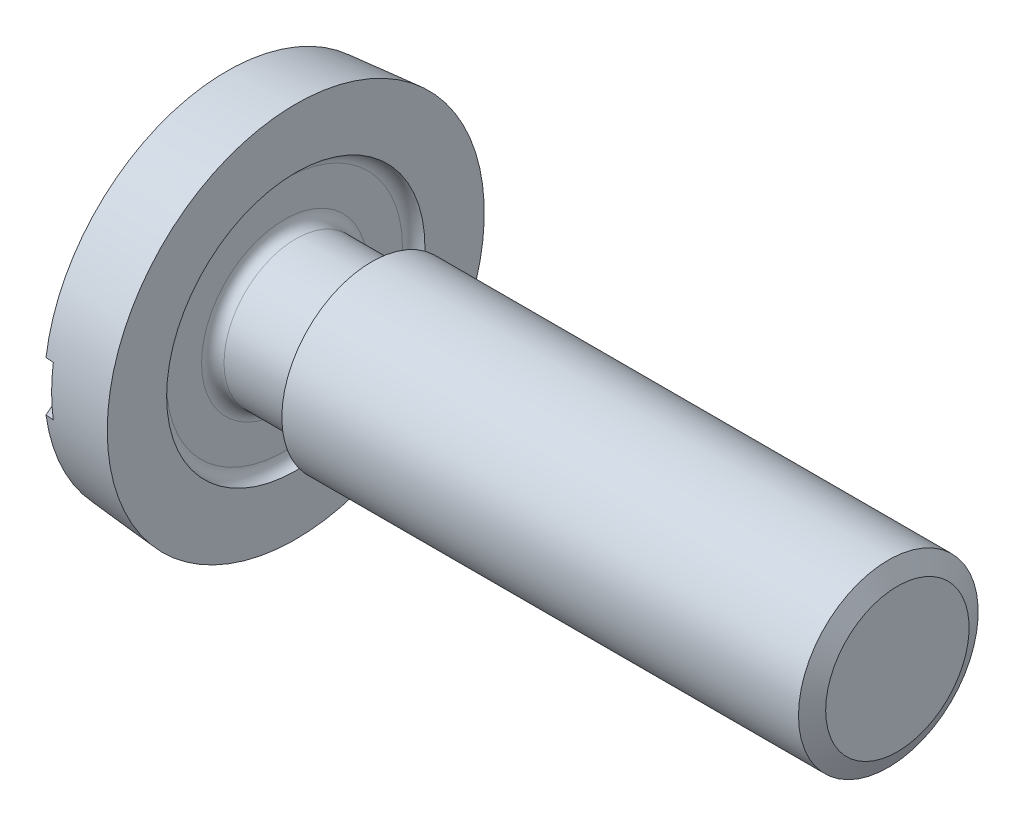
ISO-10303-21;
HEADER;
FILE_DESCRIPTION(('STEP AP214'),'2;1');
FILE_NAME('part.step','',(''),(''),'','','');
FILE_SCHEMA(('AUTOMOTIVE_DESIGN { 1 0 10303 214 1 1 1 1 }'));
ENDSEC;
DATA;
#1=APPLICATION_CONTEXT('core data for automotive mechanical design processes');
#2=APPLICATION_PROTOCOL_DEFINITION('international standard','automotive_design',2000,#1);
#3=PRODUCT_CONTEXT('',#1,'mechanical');
#4=PRODUCT('Part','Part','',(#3));
#5=PRODUCT_RELATED_PRODUCT_CATEGORY('part','',(#4));
#6=PRODUCT_DEFINITION_FORMATION('','',#4);
#7=PRODUCT_DEFINITION_CONTEXT('part definition',#1,'design');
#8=PRODUCT_DEFINITION('design','',#6,#7);
#9=PRODUCT_DEFINITION_SHAPE('','',#8);
#10=(LENGTH_UNIT() NAMED_UNIT(*) SI_UNIT(.MILLI.,.METRE.));
#11=(NAMED_UNIT(*) PLANE_ANGLE_UNIT() SI_UNIT($,.RADIAN.));
#12=(NAMED_UNIT(*) SI_UNIT($,.STERADIAN.) SOLID_ANGLE_UNIT());
#13=UNCERTAINTY_MEASURE_WITH_UNIT(LENGTH_MEASURE(1.E-05),#10,'distance_accuracy_value','');
#14=(GEOMETRIC_REPRESENTATION_CONTEXT(3) GLOBAL_UNCERTAINTY_ASSIGNED_CONTEXT((#13)) GLOBAL_UNIT_ASSIGNED_CONTEXT((#10,
#11,#12)) REPRESENTATION_CONTEXT('',''));
#15=CARTESIAN_POINT('',(0.,0.,0.));
#16=DIRECTION('',(0.,0.,1.));
#17=DIRECTION('',(1.,0.,0.));
#18=AXIS2_PLACEMENT_3D('',#15,#16,#17);
#19=CARTESIAN_POINT('',(5.16195553502615,0.,0.));
#20=DIRECTION('',(-1.,0.,0.));
#21=DIRECTION('',(0.,1.,0.));
#22=AXIS2_PLACEMENT_3D('',#19,#20,#21);
#23=SPHERICAL_SURFACE('',#22,6.88915553502615);
#24=CARTESIAN_POINT('',(-1.0922,0.,0.));
#25=DIRECTION('',(-1.,0.,0.));
#26=DIRECTION('',(0.,0.,1.));
#27=AXIS2_PLACEMENT_3D('',#24,#25,#26);
#28=CIRCLE('',#27,2.88894488169699);
#29=CARTESIAN_POINT('',(-1.0922,-0.3937,-2.861992809125));
#30=VERTEX_POINT('',#29);
#31=CARTESIAN_POINT('',(-1.0922,-0.3937,2.861992809125));
#32=VERTEX_POINT('',#31);
#33=EDGE_CURVE('E131',#30,#32,#28,.T.);
#34=ORIENTED_EDGE('',*,*,#33,.T.);
#35=CARTESIAN_POINT('',(5.16195553502615,-0.3937,0.));
#36=DIRECTION('',(0.,-1.,0.));
#37=DIRECTION('',(0.,0.,-1.));
#38=AXIS2_PLACEMENT_3D('',#35,#36,#37);
#39=CIRCLE('',#38,6.8778967930452);
#40=EDGE_CURVE('E79',#32,#30,#39,.T.);
#41=ORIENTED_EDGE('',*,*,#40,.T.);
#42=EDGE_LOOP('',(#34,#41));
#43=FACE_BOUND('',#42,.T.);
#44=ADVANCED_FACE('F15',(#43),#23,.T.);
#45=CARTESIAN_POINT('',(9.525,0.,0.));
#46=DIRECTION('',(-1.,0.,0.));
#47=DIRECTION('',(0.,0.,1.));
#48=AXIS2_PLACEMENT_3D('',#45,#46,#47);
#49=PLANE('',#48);
#50=CARTESIAN_POINT('',(9.525,0.,0.));
#51=DIRECTION('',(-1.,0.,0.));
#52=DIRECTION('',(0.,0.,1.));
#53=AXIS2_PLACEMENT_3D('',#50,#51,#52);
#54=CIRCLE('',#53,1.1354);
#55=CARTESIAN_POINT('',(9.525,0.,1.1354));
#56=VERTEX_POINT('',#55);
#57=EDGE_CURVE('E90',#56,#56,#54,.T.);
#58=ORIENTED_EDGE('',*,*,#57,.F.);
#59=EDGE_LOOP('',(#58));
#60=FACE_BOUND('',#59,.T.);
#61=ADVANCED_FACE('F17',(#60),#49,.F.);
#62=CARTESIAN_POINT('',(9.525,0.,0.));
#63=DIRECTION('',(-1.,0.,0.));
#64=DIRECTION('',(0.,0.,1.));
#65=AXIS2_PLACEMENT_3D('',#62,#63,#64);
#66=CONICAL_SURFACE('',#65,1.1354,1.10714871779409);
#67=CARTESIAN_POINT('',(9.3815,0.,0.));
#68=DIRECTION('',(-1.,0.,0.));
#69=DIRECTION('',(0.,0.,1.));
#70=AXIS2_PLACEMENT_3D('',#67,#68,#69);
#71=CIRCLE('',#70,1.4224);
#72=CARTESIAN_POINT('',(9.3815,0.,1.4224));
#73=VERTEX_POINT('',#72);
#74=EDGE_CURVE('E96',#73,#73,#71,.T.);
#75=ORIENTED_EDGE('',*,*,#74,.F.);
#76=EDGE_LOOP('',(#75));
#77=FACE_BOUND('',#76,.T.);
#78=ORIENTED_EDGE('',*,*,#57,.T.);
#79=EDGE_LOOP('',(#78));
#80=FACE_BOUND('',#79,.T.);
#81=ADVANCED_FACE('F164',(#77,#80),#66,.T.);
#82=CARTESIAN_POINT('',(-1.7272,0.,0.));
#83=DIRECTION('',(-1.,0.,0.));
#84=DIRECTION('',(0.,0.,1.));
#85=AXIS2_PLACEMENT_3D('',#82,#83,#84);
#86=CYLINDRICAL_SURFACE('',#85,1.4224);
#87=CARTESIAN_POINT('',(1.20183333333333,0.,0.));
#88=DIRECTION('',(-1.,0.,0.));
#89=DIRECTION('',(0.,0.,1.));
#90=AXIS2_PLACEMENT_3D('',#87,#88,#89);
#91=CIRCLE('',#90,1.4224);
#92=CARTESIAN_POINT('',(1.20183333333333,0.,1.4224));
#93=VERTEX_POINT('',#92);
#94=EDGE_CURVE('E100',#93,#93,#91,.T.);
#95=ORIENTED_EDGE('',*,*,#94,.F.);
#96=EDGE_LOOP('',(#95));
#97=FACE_BOUND('',#96,.T.);
#98=ORIENTED_EDGE('',*,*,#74,.T.);
#99=EDGE_LOOP('',(#98));
#100=FACE_BOUND('',#99,.T.);
#101=ADVANCED_FACE('F193',(#97,#100),#86,.T.);
#102=CARTESIAN_POINT('',(1.20183333333333,0.,0.));
#103=DIRECTION('',(1.,0.,0.));
#104=DIRECTION('',(0.,0.,-1.));
#105=AXIS2_PLACEMENT_3D('',#102,#103,#104);
#106=CONICAL_SURFACE('',#105,1.4224,1.10714871779409);
#107=CARTESIAN_POINT('',(1.05833333333333,0.,0.));
#108=DIRECTION('',(-1.,0.,0.));
#109=DIRECTION('',(0.,0.,1.));
#110=AXIS2_PLACEMENT_3D('',#107,#108,#109);
#111=CIRCLE('',#110,1.1354);
#112=CARTESIAN_POINT('',(1.05833333333333,0.,1.1354));
#113=VERTEX_POINT('',#112);
#114=EDGE_CURVE('E104',#113,#113,#111,.T.);
#115=ORIENTED_EDGE('',*,*,#114,.F.);
#116=EDGE_LOOP('',(#115));
#117=FACE_BOUND('',#116,.T.);
#118=ORIENTED_EDGE('',*,*,#94,.T.);
#119=EDGE_LOOP('',(#118));
#120=FACE_BOUND('',#119,.T.);
#121=ADVANCED_FACE('F203',(#117,#120),#106,.T.);
#122=CARTESIAN_POINT('',(-1.7272,0.,0.));
#123=DIRECTION('',(-1.,0.,0.));
#124=DIRECTION('',(0.,0.,1.));
#125=AXIS2_PLACEMENT_3D('',#122,#123,#124);
#126=CYLINDRICAL_SURFACE('',#125,1.1354);
#127=CARTESIAN_POINT('',(0.,0.,0.));
#128=DIRECTION('',(-1.,0.,0.));
#129=DIRECTION('',(0.,0.,1.));
#130=AXIS2_PLACEMENT_3D('',#127,#128,#129);
#131=CIRCLE('',#130,1.1354);
#132=CARTESIAN_POINT('',(0.,0.,1.1354));
#133=VERTEX_POINT('',#132);
#134=EDGE_CURVE('E108',#133,#133,#131,.T.);
#135=ORIENTED_EDGE('',*,*,#134,.F.);
#136=EDGE_LOOP('',(#135));
#137=FACE_BOUND('',#136,.T.);
#138=ORIENTED_EDGE('',*,*,#114,.T.);
#139=EDGE_LOOP('',(#138));
#140=FACE_BOUND('',#139,.T.);
#141=ADVANCED_FACE('F214',(#137,#140),#126,.T.);
#142=CARTESIAN_POINT('',(0.,0.,0.));
#143=DIRECTION('',(-1.,0.,0.));
#144=DIRECTION('',(0.,0.,1.));
#145=AXIS2_PLACEMENT_3D('',#142,#143,#144);
#146=TOROIDAL_SURFACE('',#145,1.3132,0.1778);
#147=ORIENTED_EDGE('',*,*,#134,.T.);
#148=EDGE_LOOP('',(#147));
#149=FACE_BOUND('',#148,.T.);
#150=CARTESIAN_POINT('',(-0.1778,0.,0.));
#151=DIRECTION('',(-1.,0.,0.));
#152=DIRECTION('',(0.,0.,1.));
#153=AXIS2_PLACEMENT_3D('',#150,#151,#152);
#154=CIRCLE('',#153,1.3132);
#155=CARTESIAN_POINT('',(-0.1778,0.,1.3132));
#156=VERTEX_POINT('',#155);
#157=EDGE_CURVE('E112',#156,#156,#154,.T.);
#158=ORIENTED_EDGE('',*,*,#157,.F.);
#159=EDGE_LOOP('',(#158));
#160=FACE_BOUND('',#159,.T.);
#161=ADVANCED_FACE('F225',(#149,#160),#146,.F.);
#162=CARTESIAN_POINT('',(-0.1778,1.3132,0.));
#163=DIRECTION('',(-1.,0.,0.));
#164=DIRECTION('',(0.,0.,1.));
#165=AXIS2_PLACEMENT_3D('',#162,#163,#164);
#166=PLANE('',#165);
#167=CARTESIAN_POINT('',(-0.1778,0.,0.));
#168=DIRECTION('',(-1.,0.,0.));
#169=DIRECTION('',(0.,0.,1.));
#170=AXIS2_PLACEMENT_3D('',#167,#168,#169);
#171=CIRCLE('',#170,1.8669);
#172=CARTESIAN_POINT('',(-0.1778,0.,1.8669));
#173=VERTEX_POINT('',#172);
#174=EDGE_CURVE('E116',#173,#173,#171,.T.);
#175=ORIENTED_EDGE('',*,*,#174,.F.);
#176=EDGE_LOOP('',(#175));
#177=FACE_BOUND('',#176,.T.);
#178=ORIENTED_EDGE('',*,*,#157,.T.);
#179=EDGE_LOOP('',(#178));
#180=FACE_BOUND('',#179,.T.);
#181=ADVANCED_FACE('F236',(#177,#180),#166,.F.);
#182=CARTESIAN_POINT('',(0.,0.,0.));
#183=DIRECTION('',(-1.,0.,0.));
#184=DIRECTION('',(0.,0.,1.));
#185=AXIS2_PLACEMENT_3D('',#182,#183,#184);
#186=TOROIDAL_SURFACE('',#185,1.8669,0.1778);
#187=ORIENTED_EDGE('',*,*,#174,.T.);
#188=EDGE_LOOP('',(#187));
#189=FACE_BOUND('',#188,.T.);
#190=CARTESIAN_POINT('',(0.,0.,0.));
#191=DIRECTION('',(-1.,0.,0.));
#192=DIRECTION('',(0.,0.,1.));
#193=AXIS2_PLACEMENT_3D('',#190,#191,#192);
#194=CIRCLE('',#193,2.0447);
#195=CARTESIAN_POINT('',(0.,0.,2.0447));
#196=VERTEX_POINT('',#195);
#197=EDGE_CURVE('E120',#196,#196,#194,.T.);
#198=ORIENTED_EDGE('',*,*,#197,.F.);
#199=EDGE_LOOP('',(#198));
#200=FACE_BOUND('',#199,.T.);
#201=ADVANCED_FACE('F247',(#189,#200),#186,.F.);
#202=CARTESIAN_POINT('',(0.,2.0447,0.));
#203=DIRECTION('',(-1.,0.,0.));
#204=DIRECTION('',(0.,0.,1.));
#205=AXIS2_PLACEMENT_3D('',#202,#203,#204);
#206=PLANE('',#205);
#207=CARTESIAN_POINT('',(0.,0.,0.));
#208=DIRECTION('',(-1.,0.,0.));
#209=DIRECTION('',(0.,0.,1.));
#210=AXIS2_PLACEMENT_3D('',#207,#208,#209);
#211=CIRCLE('',#210,2.9845);
#212=CARTESIAN_POINT('',(0.,0.,2.9845));
#213=VERTEX_POINT('',#212);
#214=EDGE_CURVE('E124',#213,#213,#211,.T.);
#215=ORIENTED_EDGE('',*,*,#214,.F.);
#216=EDGE_LOOP('',(#215));
#217=FACE_BOUND('',#216,.T.);
#218=ORIENTED_EDGE('',*,*,#197,.T.);
#219=EDGE_LOOP('',(#218));
#220=FACE_BOUND('',#219,.T.);
#221=ADVANCED_FACE('F159',(#217,#220),#206,.F.);
#222=CARTESIAN_POINT('',(0.,0.,0.));
#223=DIRECTION('',(1.,0.,0.));
#224=DIRECTION('',(0.,0.,-1.));
#225=AXIS2_PLACEMENT_3D('',#222,#223,#224);
#226=CONICAL_SURFACE('',#225,2.9845,0.0872664625997167);
#227=CARTESIAN_POINT('',(-0.9652,0.,0.));
#228=DIRECTION('',(1.,0.,0.));
#229=DIRECTION('',(0.,0.,-1.));
#230=AXIS2_PLACEMENT_3D('',#227,#228,#229);
#231=CIRCLE('',#230,2.90005594196478);
#232=CARTESIAN_POINT('',(-0.9652,0.3937,2.87320809836761));
#233=VERTEX_POINT('',#232);
#234=CARTESIAN_POINT('',(-0.9652,-0.3937,2.87320809836761));
#235=VERTEX_POINT('',#234);
#236=EDGE_CURVE('E10',#233,#235,#231,.T.);
#237=ORIENTED_EDGE('',*,*,#236,.T.);
#238=CARTESIAN_POINT('',(4.21127739127904,-0.3937,3.32974480307292));
#239=CARTESIAN_POINT('',(3.32869904396061,-0.3937,3.25199039359998));
#240=CARTESIAN_POINT('',(2.44612381304906,-0.3937,3.174200587993));
#241=CARTESIAN_POINT('',(0.680981587832547,-0.3937,3.01852777730076));
#242=CARTESIAN_POINT('',(-0.201585406472571,-0.3937,2.94064477221726));
#243=CARTESIAN_POINT('',(-1.96670919517759,-0.3937,2.78476315179441));
#244=CARTESIAN_POINT('',(-2.8492659895774,-0.3937,2.7067645364541));
#245=CARTESIAN_POINT('',(-4.61436608935992,-0.3937,2.55061464946074));
#246=CARTESIAN_POINT('',(-5.49690939474237,-0.3937,2.4724633778048));
#247=CARTESIAN_POINT('',(-6.37944429805246,-0.3937,2.39421725611234));
#248=B_SPLINE_CURVE_WITH_KNOTS('',3,(#238,#239,#240,#241,#242,#243,#244,#245,#246,#247),
.UNSPECIFIED.,.F.,.F.,(4,2,2,2,4),(0.,2.65799033042795,5.31598061098712,7.9739709137617,
10.6319612668194),.UNSPECIFIED.);
#249=EDGE_CURVE('E67',#235,#32,#248,.T.);
#250=ORIENTED_EDGE('',*,*,#249,.T.);
#251=ORIENTED_EDGE('',*,*,#33,.F.);
#252=CARTESIAN_POINT('',(-6.37944429805246,-0.3937,-2.39421725611234));
#253=CARTESIAN_POINT('',(-4.89735590200166,-0.3937,-2.52561327121971));
#254=CARTESIAN_POINT('',(-3.41524490210208,-0.3937,-2.65675386302159));
#255=CARTESIAN_POINT('',(-1.65012812598109,-0.3937,-2.81271507557492));
#256=CARTESIAN_POINT('',(-1.36713798515071,-0.3937,-2.8377126159407));
#257=CARTESIAN_POINT('',(0.68097656793339,-0.3937,-3.01858478740153));
#258=CARTESIAN_POINT('',(2.44612172120861,-0.3937,-3.17422463550848));
#259=CARTESIAN_POINT('',(4.21127739127904,-0.3937,-3.32974480307292));
#260=B_SPLINE_CURVE_WITH_KNOTS('',3,(#252,#253,#254,#255,#256,#257,#258,#259),.UNSPECIFIED.,.F.,
.F.,(4,2,2,4),(0.,4.46370447480337,5.31598064547005,10.6319612490469),.UNSPECIFIED.);
#261=CARTESIAN_POINT('',(-0.9652,-0.3937,-2.87320809836761));
#262=VERTEX_POINT('',#261);
#263=EDGE_CURVE('E39',#30,#262,#260,.T.);
#264=ORIENTED_EDGE('',*,*,#263,.T.);
#265=CARTESIAN_POINT('',(-0.9652,0.3937,-2.87320809836761));
#266=VERTEX_POINT('',#265);
#267=EDGE_CURVE('E19',#262,#266,#231,.T.);
#268=ORIENTED_EDGE('',*,*,#267,.T.);
#269=CARTESIAN_POINT('',(4.21127739127904,0.3937,-3.32974480307292));
#270=CARTESIAN_POINT('',(3.32869904396061,0.3937,-3.25199039359998));
#271=CARTESIAN_POINT('',(2.44612381304906,0.3937,-3.174200587993));
#272=CARTESIAN_POINT('',(0.680981587832547,0.3937,-3.01852777730076));
#273=CARTESIAN_POINT('',(-0.201585406472571,0.3937,-2.94064477221726));
#274=CARTESIAN_POINT('',(-1.96670919517759,0.3937,-2.78476315179441));
#275=CARTESIAN_POINT('',(-2.8492659895774,0.3937,-2.7067645364541));
#276=CARTESIAN_POINT('',(-4.61436608935992,0.3937,-2.55061464946074));
#277=CARTESIAN_POINT('',(-5.49690939474237,0.3937,-2.4724633778048));
#278=CARTESIAN_POINT('',(-6.37944429805246,0.3937,-2.39421725611234));
#279=B_SPLINE_CURVE_WITH_KNOTS('',3,(#269,#270,#271,#272,#273,#274,#275,#276,#277,#278),
.UNSPECIFIED.,.F.,.F.,(4,2,2,2,4),(0.,2.65799033042795,5.31598061098712,7.9739709137617,
10.6319612668194),.UNSPECIFIED.);
#280=CARTESIAN_POINT('',(-1.0922,0.3937,-2.861992809125));
#281=VERTEX_POINT('',#280);
#282=EDGE_CURVE('E57',#266,#281,#279,.T.);
#283=ORIENTED_EDGE('',*,*,#282,.T.);
#284=CARTESIAN_POINT('',(-1.0922,0.3937,2.861992809125));
#285=VERTEX_POINT('',#284);
#286=EDGE_CURVE('E128',#285,#281,#28,.T.);
#287=ORIENTED_EDGE('',*,*,#286,.F.);
#288=CARTESIAN_POINT('',(-6.37944429805246,0.3937,2.39421725611234));
#289=CARTESIAN_POINT('',(-4.89735590200166,0.3937,2.52561327121971));
#290=CARTESIAN_POINT('',(-3.41524490210208,0.3937,2.65675386302159));
#291=CARTESIAN_POINT('',(-1.65012812598109,0.3937,2.81271507557492));
#292=CARTESIAN_POINT('',(-1.36713798515071,0.3937,2.8377126159407));
#293=CARTESIAN_POINT('',(0.68097656793339,0.3937,3.01858478740153));
#294=CARTESIAN_POINT('',(2.44612172120861,0.3937,3.17422463550848));
#295=CARTESIAN_POINT('',(4.21127739127904,0.3937,3.32974480307292));
#296=B_SPLINE_CURVE_WITH_KNOTS('',3,(#288,#289,#290,#291,#292,#293,#294,#295),.UNSPECIFIED.,.F.,
.F.,(4,2,2,4),(0.,4.46370447480337,5.31598064547005,10.6319612490469),.UNSPECIFIED.);
#297=EDGE_CURVE('E31',#285,#233,#296,.T.);
#298=ORIENTED_EDGE('',*,*,#297,.T.);
#299=EDGE_LOOP('',(#237,#250,#251,#264,#268,#283,#287,#298));
#300=FACE_BOUND('',#299,.T.);
#301=ORIENTED_EDGE('',*,*,#214,.T.);
#302=EDGE_LOOP('',(#301));
#303=FACE_BOUND('',#302,.T.);
#304=ADVANCED_FACE('F75',(#300,#303),#226,.T.);
#305=ORIENTED_EDGE('',*,*,#286,.T.);
#306=CARTESIAN_POINT('',(5.16195553502615,0.3937,0.));
#307=DIRECTION('',(0.,1.,0.));
#308=DIRECTION('',(0.,0.,1.));
#309=AXIS2_PLACEMENT_3D('',#306,#307,#308);
#310=CIRCLE('',#309,6.8778967930452);
#311=EDGE_CURVE('E61',#281,#285,#310,.T.);
#312=ORIENTED_EDGE('',*,*,#311,.T.);
#313=EDGE_LOOP('',(#305,#312));
#314=FACE_BOUND('',#313,.T.);
#315=ADVANCED_FACE('F150',(#314),#23,.T.);
#316=CARTESIAN_POINT('',(-0.9652,0.,-3.0845));
#317=DIRECTION('',(1.,0.,0.));
#318=DIRECTION('',(0.,0.,-1.));
#319=AXIS2_PLACEMENT_3D('',#316,#317,#318);
#320=PLANE('',#319);
#321=DIRECTION('',(0.,0.,1.));
#322=VECTOR('',#321,1.);
#323=CARTESIAN_POINT('',(-0.9652,0.3937,-3.0845));
#324=LINE('',#323,#322);
#325=EDGE_CURVE('E60',#266,#233,#324,.T.);
#326=ORIENTED_EDGE('',*,*,#325,.F.);
#327=ORIENTED_EDGE('',*,*,#267,.F.);
#328=DIRECTION('',(0.,0.,1.));
#329=VECTOR('',#328,1.);
#330=CARTESIAN_POINT('',(-0.9652,-0.3937,-3.0845));
#331=LINE('',#330,#329);
#332=EDGE_CURVE('E73',#262,#235,#331,.T.);
#333=ORIENTED_EDGE('',*,*,#332,.T.);
#334=ORIENTED_EDGE('',*,*,#236,.F.);
#335=EDGE_LOOP('',(#326,#327,#333,#334));
#336=FACE_BOUND('',#335,.T.);
#337=ADVANCED_FACE('F70',(#336),#320,.F.);
#338=CARTESIAN_POINT('',(-1.8462,-0.3937,-3.0845));
#339=DIRECTION('',(0.,-1.,0.));
#340=DIRECTION('',(0.,0.,-1.));
#341=AXIS2_PLACEMENT_3D('',#338,#339,#340);
#342=PLANE('',#341);
#343=ORIENTED_EDGE('',*,*,#40,.F.);
#344=ORIENTED_EDGE('',*,*,#249,.F.);
#345=ORIENTED_EDGE('',*,*,#332,.F.);
#346=ORIENTED_EDGE('',*,*,#263,.F.);
#347=EDGE_LOOP('',(#343,#344,#345,#346));
#348=FACE_BOUND('',#347,.T.);
#349=ADVANCED_FACE('F144',(#348),#342,.F.);
#350=CARTESIAN_POINT('',(-1.8462,0.3937,-3.0845));
#351=DIRECTION('',(0.,1.,0.));
#352=DIRECTION('',(0.,0.,1.));
#353=AXIS2_PLACEMENT_3D('',#350,#351,#352);
#354=PLANE('',#353);
#355=ORIENTED_EDGE('',*,*,#325,.T.);
#356=ORIENTED_EDGE('',*,*,#297,.F.);
#357=ORIENTED_EDGE('',*,*,#311,.F.);
#358=ORIENTED_EDGE('',*,*,#282,.F.);
#359=EDGE_LOOP('',(#355,#356,#357,#358));
#360=FACE_BOUND('',#359,.T.);
#361=ADVANCED_FACE('F59',(#360),#354,.F.);
#362=CLOSED_SHELL('',(#44,#61,#81,#101,#121,#141,#161,#181,#201,#221,#304,#315,#337,#349,#361));
#363=MANIFOLD_SOLID_BREP('B1',#362);
#364=ADVANCED_BREP_SHAPE_REPRESENTATION('',(#18,#363),#14);
#365=SHAPE_DEFINITION_REPRESENTATION(#9,#364);
ENDSEC;
END-ISO-10303-21;
